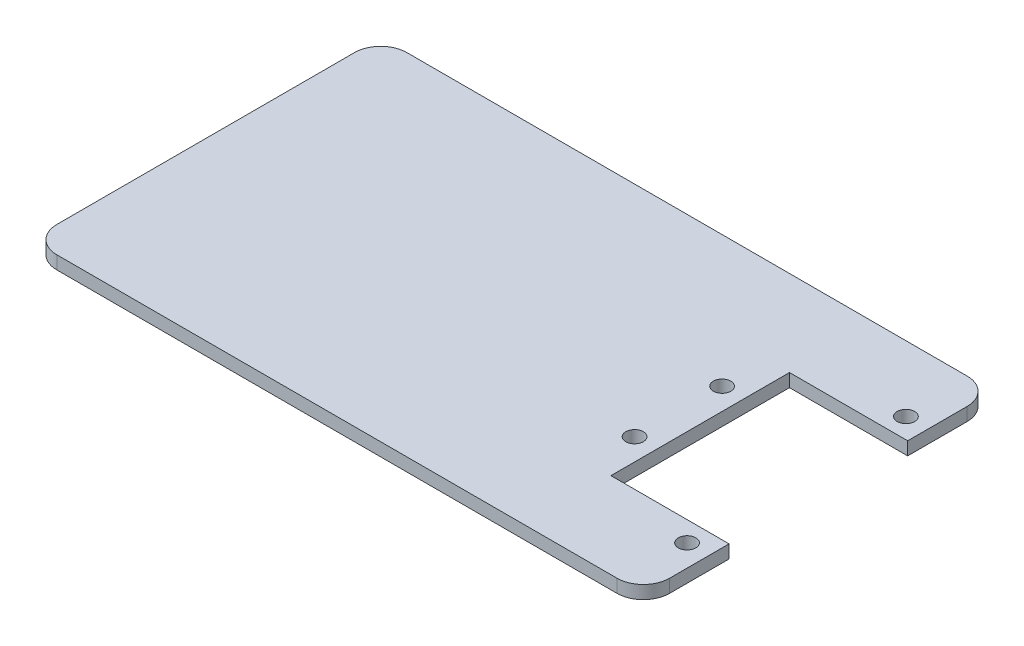
ISO-10303-21;
HEADER;
FILE_DESCRIPTION(('STEP AP214'),'2;1');
FILE_NAME('part.step','',(''),(''),'','','');
FILE_SCHEMA(('AUTOMOTIVE_DESIGN { 1 0 10303 214 1 1 1 1 }'));
ENDSEC;
DATA;
#1=APPLICATION_CONTEXT('core data for automotive mechanical design processes');
#2=APPLICATION_PROTOCOL_DEFINITION('international standard','automotive_design',2000,#1);
#3=PRODUCT_CONTEXT('',#1,'mechanical');
#4=PRODUCT('Part','Part','',(#3));
#5=PRODUCT_RELATED_PRODUCT_CATEGORY('part','',(#4));
#6=PRODUCT_DEFINITION_FORMATION('','',#4);
#7=PRODUCT_DEFINITION_CONTEXT('part definition',#1,'design');
#8=PRODUCT_DEFINITION('design','',#6,#7);
#9=PRODUCT_DEFINITION_SHAPE('','',#8);
#10=(LENGTH_UNIT() NAMED_UNIT(*) SI_UNIT(.MILLI.,.METRE.));
#11=(NAMED_UNIT(*) PLANE_ANGLE_UNIT() SI_UNIT($,.RADIAN.));
#12=(NAMED_UNIT(*) SI_UNIT($,.STERADIAN.) SOLID_ANGLE_UNIT());
#13=UNCERTAINTY_MEASURE_WITH_UNIT(LENGTH_MEASURE(1.E-05),#10,'distance_accuracy_value','');
#14=(GEOMETRIC_REPRESENTATION_CONTEXT(3) GLOBAL_UNCERTAINTY_ASSIGNED_CONTEXT((#13)) GLOBAL_UNIT_ASSIGNED_CONTEXT((#10,
#11,#12)) REPRESENTATION_CONTEXT('',''));
#15=CARTESIAN_POINT('',(0.,0.,0.));
#16=DIRECTION('',(0.,0.,1.));
#17=DIRECTION('',(1.,0.,0.));
#18=AXIS2_PLACEMENT_3D('',#15,#16,#17);
#19=CARTESIAN_POINT('',(35.,1.5,20.));
#20=DIRECTION('',(-1.,0.,0.));
#21=DIRECTION('',(0.,0.,1.));
#22=AXIS2_PLACEMENT_3D('',#19,#20,#21);
#23=PLANE('',#22);
#24=DIRECTION('',(0.,0.,-1.));
#25=VECTOR('',#24,1.);
#26=CARTESIAN_POINT('',(35.,0.,20.));
#27=LINE('',#26,#25);
#28=CARTESIAN_POINT('',(35.,0.,17.));
#29=VERTEX_POINT('',#28);
#30=CARTESIAN_POINT('',(35.,0.,10.2));
#31=VERTEX_POINT('',#30);
#32=EDGE_CURVE('E154',#29,#31,#27,.T.);
#33=ORIENTED_EDGE('',*,*,#32,.T.);
#34=DIRECTION('',(0.,1.,0.));
#35=VECTOR('',#34,1.);
#36=CARTESIAN_POINT('',(35.,0.,10.2));
#37=LINE('',#36,#35);
#38=CARTESIAN_POINT('',(35.,1.5,10.2));
#39=VERTEX_POINT('',#38);
#40=EDGE_CURVE('E221',#31,#39,#37,.T.);
#41=ORIENTED_EDGE('',*,*,#40,.T.);
#42=DIRECTION('',(0.,0.,-1.));
#43=VECTOR('',#42,1.);
#44=CARTESIAN_POINT('',(35.,1.5,20.));
#45=LINE('',#44,#43);
#46=CARTESIAN_POINT('',(35.,1.5,17.));
#47=VERTEX_POINT('',#46);
#48=EDGE_CURVE('E220',#47,#39,#45,.T.);
#49=ORIENTED_EDGE('',*,*,#48,.F.);
#50=DIRECTION('',(0.,-1.,0.));
#51=VECTOR('',#50,1.);
#52=CARTESIAN_POINT('',(35.,1.5,17.));
#53=LINE('',#52,#51);
#54=EDGE_CURVE('E193',#47,#29,#53,.T.);
#55=ORIENTED_EDGE('',*,*,#54,.T.);
#56=EDGE_LOOP('',(#33,#41,#49,#55));
#57=FACE_BOUND('',#56,.T.);
#58=ADVANCED_FACE('F46',(#57),#23,.F.);
#59=CARTESIAN_POINT('',(-35.,1.5,20.));
#60=DIRECTION('',(1.,0.,0.));
#61=DIRECTION('',(0.,0.,-1.));
#62=AXIS2_PLACEMENT_3D('',#59,#60,#61);
#63=PLANE('',#62);
#64=DIRECTION('',(0.,0.,1.));
#65=VECTOR('',#64,1.);
#66=CARTESIAN_POINT('',(-35.,1.5,20.));
#67=LINE('',#66,#65);
#68=CARTESIAN_POINT('',(-35.,1.5,-17.));
#69=VERTEX_POINT('',#68);
#70=CARTESIAN_POINT('',(-35.,1.5,17.));
#71=VERTEX_POINT('',#70);
#72=EDGE_CURVE('E166',#69,#71,#67,.T.);
#73=ORIENTED_EDGE('',*,*,#72,.F.);
#74=DIRECTION('',(0.,-1.,0.));
#75=VECTOR('',#74,1.);
#76=CARTESIAN_POINT('',(-35.,1.5,-17.));
#77=LINE('',#76,#75);
#78=CARTESIAN_POINT('',(-35.,0.,-17.));
#79=VERTEX_POINT('',#78);
#80=EDGE_CURVE('E169',#69,#79,#77,.T.);
#81=ORIENTED_EDGE('',*,*,#80,.T.);
#82=DIRECTION('',(0.,0.,1.));
#83=VECTOR('',#82,1.);
#84=CARTESIAN_POINT('',(-35.,0.,20.));
#85=LINE('',#84,#83);
#86=CARTESIAN_POINT('',(-35.,0.,17.));
#87=VERTEX_POINT('',#86);
#88=EDGE_CURVE('E160',#79,#87,#85,.T.);
#89=ORIENTED_EDGE('',*,*,#88,.T.);
#90=DIRECTION('',(0.,-1.,0.));
#91=VECTOR('',#90,1.);
#92=CARTESIAN_POINT('',(-35.,1.5,17.));
#93=LINE('',#92,#91);
#94=EDGE_CURVE('E167',#87,#71,#93,.F.);
#95=ORIENTED_EDGE('',*,*,#94,.T.);
#96=EDGE_LOOP('',(#73,#81,#89,#95));
#97=FACE_BOUND('',#96,.T.);
#98=ADVANCED_FACE('F239',(#97),#63,.F.);
#99=CARTESIAN_POINT('',(35.,1.5,20.));
#100=DIRECTION('',(0.,0.,-1.));
#101=DIRECTION('',(-1.,0.,0.));
#102=AXIS2_PLACEMENT_3D('',#99,#100,#101);
#103=PLANE('',#102);
#104=DIRECTION('',(1.,0.,0.));
#105=VECTOR('',#104,1.);
#106=CARTESIAN_POINT('',(35.,0.,20.));
#107=LINE('',#106,#105);
#108=CARTESIAN_POINT('',(-32.,0.,20.));
#109=VERTEX_POINT('',#108);
#110=CARTESIAN_POINT('',(32.,0.,20.));
#111=VERTEX_POINT('',#110);
#112=EDGE_CURVE('E155',#109,#111,#107,.T.);
#113=ORIENTED_EDGE('',*,*,#112,.T.);
#114=DIRECTION('',(0.,-1.,0.));
#115=VECTOR('',#114,1.);
#116=CARTESIAN_POINT('',(32.,1.5,20.));
#117=LINE('',#116,#115);
#118=CARTESIAN_POINT('',(32.,1.5,20.));
#119=VERTEX_POINT('',#118);
#120=EDGE_CURVE('E13',#111,#119,#117,.F.);
#121=ORIENTED_EDGE('',*,*,#120,.T.);
#122=DIRECTION('',(1.,0.,0.));
#123=VECTOR('',#122,1.);
#124=CARTESIAN_POINT('',(35.,1.5,20.));
#125=LINE('',#124,#123);
#126=CARTESIAN_POINT('',(-32.,1.5,20.));
#127=VERTEX_POINT('',#126);
#128=EDGE_CURVE('E205',#127,#119,#125,.T.);
#129=ORIENTED_EDGE('',*,*,#128,.F.);
#130=DIRECTION('',(0.,-1.,0.));
#131=VECTOR('',#130,1.);
#132=CARTESIAN_POINT('',(-32.,1.5,20.));
#133=LINE('',#132,#131);
#134=EDGE_CURVE('E54',#127,#109,#133,.T.);
#135=ORIENTED_EDGE('',*,*,#134,.T.);
#136=EDGE_LOOP('',(#113,#121,#129,#135));
#137=FACE_BOUND('',#136,.T.);
#138=ADVANCED_FACE('F202',(#137),#103,.F.);
#139=CARTESIAN_POINT('',(35.,1.5,-10.2));
#140=VERTEX_POINT('',#139);
#141=CARTESIAN_POINT('',(35.,1.5,-17.));
#142=VERTEX_POINT('',#141);
#143=EDGE_CURVE('E69',#140,#142,#45,.T.);
#144=ORIENTED_EDGE('',*,*,#143,.F.);
#145=DIRECTION('',(0.,1.,0.));
#146=VECTOR('',#145,1.);
#147=CARTESIAN_POINT('',(35.,0.,-10.2));
#148=LINE('',#147,#146);
#149=CARTESIAN_POINT('',(35.,0.,-10.2));
#150=VERTEX_POINT('',#149);
#151=EDGE_CURVE('E138',#150,#140,#148,.T.);
#152=ORIENTED_EDGE('',*,*,#151,.F.);
#153=CARTESIAN_POINT('',(35.,0.,-17.));
#154=VERTEX_POINT('',#153);
#155=EDGE_CURVE('E146',#150,#154,#27,.T.);
#156=ORIENTED_EDGE('',*,*,#155,.T.);
#157=DIRECTION('',(0.,-1.,0.));
#158=VECTOR('',#157,1.);
#159=CARTESIAN_POINT('',(35.,1.5,-17.));
#160=LINE('',#159,#158);
#161=EDGE_CURVE('E196',#154,#142,#160,.F.);
#162=ORIENTED_EDGE('',*,*,#161,.T.);
#163=EDGE_LOOP('',(#144,#152,#156,#162));
#164=FACE_BOUND('',#163,.T.);
#165=ADVANCED_FACE('F145',(#164),#23,.F.);
#166=CARTESIAN_POINT('',(35.,1.5,-20.));
#167=DIRECTION('',(0.,0.,1.));
#168=DIRECTION('',(1.,0.,0.));
#169=AXIS2_PLACEMENT_3D('',#166,#167,#168);
#170=PLANE('',#169);
#171=DIRECTION('',(-1.,0.,0.));
#172=VECTOR('',#171,1.);
#173=CARTESIAN_POINT('',(35.,0.,-20.));
#174=LINE('',#173,#172);
#175=CARTESIAN_POINT('',(32.,0.,-20.));
#176=VERTEX_POINT('',#175);
#177=CARTESIAN_POINT('',(-32.,0.,-20.));
#178=VERTEX_POINT('',#177);
#179=EDGE_CURVE('E158',#176,#178,#174,.T.);
#180=ORIENTED_EDGE('',*,*,#179,.T.);
#181=DIRECTION('',(0.,-1.,0.));
#182=VECTOR('',#181,1.);
#183=CARTESIAN_POINT('',(-32.,1.5,-20.));
#184=LINE('',#183,#182);
#185=CARTESIAN_POINT('',(-32.,1.5,-20.));
#186=VERTEX_POINT('',#185);
#187=EDGE_CURVE('E183',#178,#186,#184,.F.);
#188=ORIENTED_EDGE('',*,*,#187,.T.);
#189=DIRECTION('',(-1.,0.,0.));
#190=VECTOR('',#189,1.);
#191=CARTESIAN_POINT('',(35.,1.5,-20.));
#192=LINE('',#191,#190);
#193=CARTESIAN_POINT('',(32.,1.5,-20.));
#194=VERTEX_POINT('',#193);
#195=EDGE_CURVE('E170',#194,#186,#192,.T.);
#196=ORIENTED_EDGE('',*,*,#195,.F.);
#197=DIRECTION('',(0.,-1.,0.));
#198=VECTOR('',#197,1.);
#199=CARTESIAN_POINT('',(32.,1.5,-20.));
#200=LINE('',#199,#198);
#201=EDGE_CURVE('E180',#194,#176,#200,.T.);
#202=ORIENTED_EDGE('',*,*,#201,.T.);
#203=EDGE_LOOP('',(#180,#188,#196,#202));
#204=FACE_BOUND('',#203,.T.);
#205=ADVANCED_FACE('F246',(#204),#170,.F.);
#206=CARTESIAN_POINT('',(0.,1.5,0.));
#207=DIRECTION('',(0.,1.,0.));
#208=DIRECTION('',(0.,0.,1.));
#209=AXIS2_PLACEMENT_3D('',#206,#207,#208);
#210=PLANE('',#209);
#211=CARTESIAN_POINT('',(19.,1.5,5.));
#212=DIRECTION('',(0.,-1.,0.));
#213=DIRECTION('',(0.,0.,1.));
#214=AXIS2_PLACEMENT_3D('',#211,#212,#213);
#215=CIRCLE('',#214,1.);
#216=CARTESIAN_POINT('',(19.,1.5,6.));
#217=VERTEX_POINT('',#216);
#218=EDGE_CURVE('E405',#217,#217,#215,.T.);
#219=ORIENTED_EDGE('',*,*,#218,.T.);
#220=EDGE_LOOP('',(#219));
#221=FACE_BOUND('',#220,.T.);
#222=CARTESIAN_POINT('',(32.5,1.5,12.5000000000001));
#223=DIRECTION('',(0.,-1.,0.));
#224=DIRECTION('',(0.,0.,1.));
#225=AXIS2_PLACEMENT_3D('',#222,#223,#224);
#226=CIRCLE('',#225,0.999999999999998);
#227=CARTESIAN_POINT('',(32.5,1.5,13.5000000000001));
#228=VERTEX_POINT('',#227);
#229=EDGE_CURVE('E413',#228,#228,#226,.T.);
#230=ORIENTED_EDGE('',*,*,#229,.T.);
#231=EDGE_LOOP('',(#230));
#232=FACE_BOUND('',#231,.T.);
#233=CARTESIAN_POINT('',(32.5,1.5,-12.5000000000001));
#234=DIRECTION('',(0.,-1.,0.));
#235=DIRECTION('',(0.,0.,-1.));
#236=AXIS2_PLACEMENT_3D('',#233,#234,#235);
#237=CIRCLE('',#236,0.999999999999998);
#238=CARTESIAN_POINT('',(32.5,1.5,-13.5000000000001));
#239=VERTEX_POINT('',#238);
#240=EDGE_CURVE('E419',#239,#239,#237,.T.);
#241=ORIENTED_EDGE('',*,*,#240,.T.);
#242=EDGE_LOOP('',(#241));
#243=FACE_BOUND('',#242,.T.);
#244=CARTESIAN_POINT('',(19.,1.5,-5.));
#245=DIRECTION('',(0.,-1.,0.));
#246=DIRECTION('',(0.,0.,-1.));
#247=AXIS2_PLACEMENT_3D('',#244,#245,#246);
#248=CIRCLE('',#247,1.);
#249=CARTESIAN_POINT('',(19.,1.5,-6.));
#250=VERTEX_POINT('',#249);
#251=EDGE_CURVE('E425',#250,#250,#248,.T.);
#252=ORIENTED_EDGE('',*,*,#251,.T.);
#253=EDGE_LOOP('',(#252));
#254=FACE_BOUND('',#253,.T.);
#255=DIRECTION('',(1.,0.,0.));
#256=VECTOR('',#255,1.);
#257=CARTESIAN_POINT('',(35.,1.5,10.2));
#258=LINE('',#257,#256);
#259=CARTESIAN_POINT('',(21.5,1.5,10.2));
#260=VERTEX_POINT('',#259);
#261=EDGE_CURVE('E142',#260,#39,#258,.T.);
#262=ORIENTED_EDGE('',*,*,#261,.F.);
#263=DIRECTION('',(0.,0.,1.));
#264=VECTOR('',#263,1.);
#265=CARTESIAN_POINT('',(21.5,1.5,-10.2));
#266=LINE('',#265,#264);
#267=CARTESIAN_POINT('',(21.5,1.5,-10.2));
#268=VERTEX_POINT('',#267);
#269=EDGE_CURVE('E433',#268,#260,#266,.T.);
#270=ORIENTED_EDGE('',*,*,#269,.F.);
#271=DIRECTION('',(-1.,0.,0.));
#272=VECTOR('',#271,1.);
#273=CARTESIAN_POINT('',(35.,1.5,-10.2));
#274=LINE('',#273,#272);
#275=EDGE_CURVE('E428',#140,#268,#274,.T.);
#276=ORIENTED_EDGE('',*,*,#275,.F.);
#277=ORIENTED_EDGE('',*,*,#143,.T.);
#278=CARTESIAN_POINT('',(32.,1.5,-17.));
#279=DIRECTION('',(0.,1.,0.));
#280=DIRECTION('',(0.,0.,1.));
#281=AXIS2_PLACEMENT_3D('',#278,#279,#280);
#282=CIRCLE('',#281,3.);
#283=EDGE_CURVE('E189',#142,#194,#282,.T.);
#284=ORIENTED_EDGE('',*,*,#283,.T.);
#285=ORIENTED_EDGE('',*,*,#195,.T.);
#286=CARTESIAN_POINT('',(-32.,1.5,-17.));
#287=DIRECTION('',(0.,1.,0.));
#288=DIRECTION('',(0.,0.,1.));
#289=AXIS2_PLACEMENT_3D('',#286,#287,#288);
#290=CIRCLE('',#289,3.);
#291=EDGE_CURVE('E191',#186,#69,#290,.T.);
#292=ORIENTED_EDGE('',*,*,#291,.T.);
#293=ORIENTED_EDGE('',*,*,#72,.T.);
#294=CARTESIAN_POINT('',(-32.,1.5,17.));
#295=DIRECTION('',(0.,1.,0.));
#296=DIRECTION('',(0.,0.,1.));
#297=AXIS2_PLACEMENT_3D('',#294,#295,#296);
#298=CIRCLE('',#297,3.);
#299=EDGE_CURVE('E185',#71,#127,#298,.T.);
#300=ORIENTED_EDGE('',*,*,#299,.T.);
#301=ORIENTED_EDGE('',*,*,#128,.T.);
#302=CARTESIAN_POINT('',(32.,1.5,17.));
#303=DIRECTION('',(0.,1.,0.));
#304=DIRECTION('',(0.,0.,1.));
#305=AXIS2_PLACEMENT_3D('',#302,#303,#304);
#306=CIRCLE('',#305,3.);
#307=EDGE_CURVE('E187',#119,#47,#306,.T.);
#308=ORIENTED_EDGE('',*,*,#307,.T.);
#309=ORIENTED_EDGE('',*,*,#48,.T.);
#310=EDGE_LOOP('',(#262,#270,#276,#277,#284,#285,#292,#293,#300,#301,#308,#309));
#311=FACE_BOUND('',#310,.T.);
#312=ADVANCED_FACE('F238',(#221,#232,#243,#254,#311),#210,.T.);
#313=CARTESIAN_POINT('',(0.,0.,0.));
#314=DIRECTION('',(0.,1.,0.));
#315=DIRECTION('',(0.,0.,1.));
#316=AXIS2_PLACEMENT_3D('',#313,#314,#315);
#317=PLANE('',#316);
#318=CARTESIAN_POINT('',(19.,0.,5.));
#319=DIRECTION('',(0.,-1.,0.));
#320=DIRECTION('',(0.,0.,1.));
#321=AXIS2_PLACEMENT_3D('',#318,#319,#320);
#322=CIRCLE('',#321,1.);
#323=CARTESIAN_POINT('',(19.,0.,6.));
#324=VERTEX_POINT('',#323);
#325=EDGE_CURVE('E408',#324,#324,#322,.T.);
#326=ORIENTED_EDGE('',*,*,#325,.F.);
#327=EDGE_LOOP('',(#326));
#328=FACE_BOUND('',#327,.T.);
#329=CARTESIAN_POINT('',(32.5,0.,12.5000000000001));
#330=DIRECTION('',(0.,-1.,0.));
#331=DIRECTION('',(0.,0.,1.));
#332=AXIS2_PLACEMENT_3D('',#329,#330,#331);
#333=CIRCLE('',#332,0.999999999999998);
#334=CARTESIAN_POINT('',(32.5,0.,13.5000000000001));
#335=VERTEX_POINT('',#334);
#336=EDGE_CURVE('E410',#335,#335,#333,.T.);
#337=ORIENTED_EDGE('',*,*,#336,.F.);
#338=EDGE_LOOP('',(#337));
#339=FACE_BOUND('',#338,.T.);
#340=CARTESIAN_POINT('',(32.5,0.,-12.5000000000001));
#341=DIRECTION('',(0.,-1.,0.));
#342=DIRECTION('',(0.,0.,-1.));
#343=AXIS2_PLACEMENT_3D('',#340,#341,#342);
#344=CIRCLE('',#343,0.999999999999998);
#345=CARTESIAN_POINT('',(32.5,0.,-13.5000000000001));
#346=VERTEX_POINT('',#345);
#347=EDGE_CURVE('E416',#346,#346,#344,.T.);
#348=ORIENTED_EDGE('',*,*,#347,.F.);
#349=EDGE_LOOP('',(#348));
#350=FACE_BOUND('',#349,.T.);
#351=CARTESIAN_POINT('',(19.,0.,-5.));
#352=DIRECTION('',(0.,-1.,0.));
#353=DIRECTION('',(0.,0.,-1.));
#354=AXIS2_PLACEMENT_3D('',#351,#352,#353);
#355=CIRCLE('',#354,1.);
#356=CARTESIAN_POINT('',(19.,0.,-6.));
#357=VERTEX_POINT('',#356);
#358=EDGE_CURVE('E422',#357,#357,#355,.T.);
#359=ORIENTED_EDGE('',*,*,#358,.F.);
#360=EDGE_LOOP('',(#359));
#361=FACE_BOUND('',#360,.T.);
#362=DIRECTION('',(0.,0.,1.));
#363=VECTOR('',#362,1.);
#364=CARTESIAN_POINT('',(21.5,0.,-10.2));
#365=LINE('',#364,#363);
#366=CARTESIAN_POINT('',(21.5,0.,-10.2));
#367=VERTEX_POINT('',#366);
#368=CARTESIAN_POINT('',(21.5,0.,10.2));
#369=VERTEX_POINT('',#368);
#370=EDGE_CURVE('E61',#367,#369,#365,.T.);
#371=ORIENTED_EDGE('',*,*,#370,.T.);
#372=DIRECTION('',(1.,0.,0.));
#373=VECTOR('',#372,1.);
#374=CARTESIAN_POINT('',(35.,0.,10.2));
#375=LINE('',#374,#373);
#376=EDGE_CURVE('E148',#369,#31,#375,.T.);
#377=ORIENTED_EDGE('',*,*,#376,.T.);
#378=ORIENTED_EDGE('',*,*,#32,.F.);
#379=CARTESIAN_POINT('',(32.,0.,17.));
#380=DIRECTION('',(0.,1.,0.));
#381=DIRECTION('',(0.,0.,1.));
#382=AXIS2_PLACEMENT_3D('',#379,#380,#381);
#383=CIRCLE('',#382,3.);
#384=EDGE_CURVE('E175',#29,#111,#383,.F.);
#385=ORIENTED_EDGE('',*,*,#384,.T.);
#386=ORIENTED_EDGE('',*,*,#112,.F.);
#387=CARTESIAN_POINT('',(-32.,0.,17.));
#388=DIRECTION('',(0.,1.,0.));
#389=DIRECTION('',(0.,0.,1.));
#390=AXIS2_PLACEMENT_3D('',#387,#388,#389);
#391=CIRCLE('',#390,3.);
#392=EDGE_CURVE('E173',#109,#87,#391,.F.);
#393=ORIENTED_EDGE('',*,*,#392,.T.);
#394=ORIENTED_EDGE('',*,*,#88,.F.);
#395=CARTESIAN_POINT('',(-32.,0.,-17.));
#396=DIRECTION('',(0.,1.,0.));
#397=DIRECTION('',(0.,0.,1.));
#398=AXIS2_PLACEMENT_3D('',#395,#396,#397);
#399=CIRCLE('',#398,3.);
#400=EDGE_CURVE('E178',#79,#178,#399,.F.);
#401=ORIENTED_EDGE('',*,*,#400,.T.);
#402=ORIENTED_EDGE('',*,*,#179,.F.);
#403=CARTESIAN_POINT('',(32.,0.,-17.));
#404=DIRECTION('',(0.,1.,0.));
#405=DIRECTION('',(0.,0.,1.));
#406=AXIS2_PLACEMENT_3D('',#403,#404,#405);
#407=CIRCLE('',#406,3.);
#408=EDGE_CURVE('E152',#176,#154,#407,.F.);
#409=ORIENTED_EDGE('',*,*,#408,.T.);
#410=ORIENTED_EDGE('',*,*,#155,.F.);
#411=DIRECTION('',(-1.,0.,0.));
#412=VECTOR('',#411,1.);
#413=CARTESIAN_POINT('',(35.,0.,-10.2));
#414=LINE('',#413,#412);
#415=EDGE_CURVE('E134',#150,#367,#414,.T.);
#416=ORIENTED_EDGE('',*,*,#415,.T.);
#417=EDGE_LOOP('',(#371,#377,#378,#385,#386,#393,#394,#401,#402,#409,#410,#416));
#418=FACE_BOUND('',#417,.T.);
#419=ADVANCED_FACE('F150',(#328,#339,#350,#361,#418),#317,.F.);
#420=CARTESIAN_POINT('',(-32.,1.5,-17.));
#421=DIRECTION('',(0.,-1.,0.));
#422=DIRECTION('',(0.,0.,-1.));
#423=AXIS2_PLACEMENT_3D('',#420,#421,#422);
#424=CYLINDRICAL_SURFACE('',#423,3.);
#425=ORIENTED_EDGE('',*,*,#291,.F.);
#426=ORIENTED_EDGE('',*,*,#187,.F.);
#427=ORIENTED_EDGE('',*,*,#400,.F.);
#428=ORIENTED_EDGE('',*,*,#80,.F.);
#429=EDGE_LOOP('',(#425,#426,#427,#428));
#430=FACE_BOUND('',#429,.T.);
#431=ADVANCED_FACE('F243',(#430),#424,.T.);
#432=CARTESIAN_POINT('',(32.,1.5,-17.));
#433=DIRECTION('',(0.,-1.,0.));
#434=DIRECTION('',(0.,0.,-1.));
#435=AXIS2_PLACEMENT_3D('',#432,#433,#434);
#436=CYLINDRICAL_SURFACE('',#435,3.);
#437=ORIENTED_EDGE('',*,*,#283,.F.);
#438=ORIENTED_EDGE('',*,*,#161,.F.);
#439=ORIENTED_EDGE('',*,*,#408,.F.);
#440=ORIENTED_EDGE('',*,*,#201,.F.);
#441=EDGE_LOOP('',(#437,#438,#439,#440));
#442=FACE_BOUND('',#441,.T.);
#443=ADVANCED_FACE('F251',(#442),#436,.T.);
#444=CARTESIAN_POINT('',(32.,1.5,17.));
#445=DIRECTION('',(0.,-1.,0.));
#446=DIRECTION('',(0.,0.,-1.));
#447=AXIS2_PLACEMENT_3D('',#444,#445,#446);
#448=CYLINDRICAL_SURFACE('',#447,3.);
#449=ORIENTED_EDGE('',*,*,#307,.F.);
#450=ORIENTED_EDGE('',*,*,#120,.F.);
#451=ORIENTED_EDGE('',*,*,#384,.F.);
#452=ORIENTED_EDGE('',*,*,#54,.F.);
#453=EDGE_LOOP('',(#449,#450,#451,#452));
#454=FACE_BOUND('',#453,.T.);
#455=ADVANCED_FACE('F215',(#454),#448,.T.);
#456=CARTESIAN_POINT('',(-32.,1.5,17.));
#457=DIRECTION('',(0.,-1.,0.));
#458=DIRECTION('',(0.,0.,-1.));
#459=AXIS2_PLACEMENT_3D('',#456,#457,#458);
#460=CYLINDRICAL_SURFACE('',#459,3.);
#461=ORIENTED_EDGE('',*,*,#299,.F.);
#462=ORIENTED_EDGE('',*,*,#94,.F.);
#463=ORIENTED_EDGE('',*,*,#392,.F.);
#464=ORIENTED_EDGE('',*,*,#134,.F.);
#465=EDGE_LOOP('',(#461,#462,#463,#464));
#466=FACE_BOUND('',#465,.T.);
#467=ADVANCED_FACE('F48',(#466),#460,.T.);
#468=CARTESIAN_POINT('',(35.,0.,10.2));
#469=DIRECTION('',(0.,0.,1.));
#470=DIRECTION('',(1.,0.,0.));
#471=AXIS2_PLACEMENT_3D('',#468,#469,#470);
#472=PLANE('',#471);
#473=ORIENTED_EDGE('',*,*,#261,.T.);
#474=ORIENTED_EDGE('',*,*,#40,.F.);
#475=ORIENTED_EDGE('',*,*,#376,.F.);
#476=DIRECTION('',(0.,1.,0.));
#477=VECTOR('',#476,1.);
#478=CARTESIAN_POINT('',(21.5,0.,10.2));
#479=LINE('',#478,#477);
#480=EDGE_CURVE('E230',#369,#260,#479,.T.);
#481=ORIENTED_EDGE('',*,*,#480,.T.);
#482=EDGE_LOOP('',(#473,#474,#475,#481));
#483=FACE_BOUND('',#482,.T.);
#484=ADVANCED_FACE('F332',(#483),#472,.F.);
#485=CARTESIAN_POINT('',(21.5,0.,-10.2));
#486=DIRECTION('',(-1.,0.,0.));
#487=DIRECTION('',(0.,0.,1.));
#488=AXIS2_PLACEMENT_3D('',#485,#486,#487);
#489=PLANE('',#488);
#490=ORIENTED_EDGE('',*,*,#269,.T.);
#491=ORIENTED_EDGE('',*,*,#480,.F.);
#492=ORIENTED_EDGE('',*,*,#370,.F.);
#493=DIRECTION('',(0.,1.,0.));
#494=VECTOR('',#493,1.);
#495=CARTESIAN_POINT('',(21.5,0.,-10.2));
#496=LINE('',#495,#494);
#497=EDGE_CURVE('E139',#367,#268,#496,.T.);
#498=ORIENTED_EDGE('',*,*,#497,.T.);
#499=EDGE_LOOP('',(#490,#491,#492,#498));
#500=FACE_BOUND('',#499,.T.);
#501=ADVANCED_FACE('F342',(#500),#489,.F.);
#502=CARTESIAN_POINT('',(35.,0.,-10.2));
#503=DIRECTION('',(0.,0.,-1.));
#504=DIRECTION('',(-1.,0.,0.));
#505=AXIS2_PLACEMENT_3D('',#502,#503,#504);
#506=PLANE('',#505);
#507=ORIENTED_EDGE('',*,*,#275,.T.);
#508=ORIENTED_EDGE('',*,*,#497,.F.);
#509=ORIENTED_EDGE('',*,*,#415,.F.);
#510=ORIENTED_EDGE('',*,*,#151,.T.);
#511=EDGE_LOOP('',(#507,#508,#509,#510));
#512=FACE_BOUND('',#511,.T.);
#513=ADVANCED_FACE('F137',(#512),#506,.F.);
#514=CARTESIAN_POINT('',(19.,1.5,-5.));
#515=DIRECTION('',(0.,-1.,0.));
#516=DIRECTION('',(0.,0.,-1.));
#517=AXIS2_PLACEMENT_3D('',#514,#515,#516);
#518=CYLINDRICAL_SURFACE('',#517,1.);
#519=ORIENTED_EDGE('',*,*,#251,.F.);
#520=EDGE_LOOP('',(#519));
#521=FACE_BOUND('',#520,.T.);
#522=ORIENTED_EDGE('',*,*,#358,.T.);
#523=EDGE_LOOP('',(#522));
#524=FACE_BOUND('',#523,.T.);
#525=ADVANCED_FACE('F357',(#521,#524),#518,.F.);
#526=CARTESIAN_POINT('',(32.5,1.5,-12.5000000000001));
#527=DIRECTION('',(0.,-1.,0.));
#528=DIRECTION('',(0.,0.,-1.));
#529=AXIS2_PLACEMENT_3D('',#526,#527,#528);
#530=CYLINDRICAL_SURFACE('',#529,0.999999999999998);
#531=ORIENTED_EDGE('',*,*,#240,.F.);
#532=EDGE_LOOP('',(#531));
#533=FACE_BOUND('',#532,.T.);
#534=ORIENTED_EDGE('',*,*,#347,.T.);
#535=EDGE_LOOP('',(#534));
#536=FACE_BOUND('',#535,.T.);
#537=ADVANCED_FACE('F364',(#533,#536),#530,.F.);
#538=CARTESIAN_POINT('',(32.5,1.5,12.5000000000001));
#539=DIRECTION('',(0.,-1.,0.));
#540=DIRECTION('',(0.,0.,-1.));
#541=AXIS2_PLACEMENT_3D('',#538,#539,#540);
#542=CYLINDRICAL_SURFACE('',#541,0.999999999999998);
#543=ORIENTED_EDGE('',*,*,#229,.F.);
#544=EDGE_LOOP('',(#543));
#545=FACE_BOUND('',#544,.T.);
#546=ORIENTED_EDGE('',*,*,#336,.T.);
#547=EDGE_LOOP('',(#546));
#548=FACE_BOUND('',#547,.T.);
#549=ADVANCED_FACE('F373',(#545,#548),#542,.F.);
#550=CARTESIAN_POINT('',(19.,1.5,5.));
#551=DIRECTION('',(0.,-1.,0.));
#552=DIRECTION('',(0.,0.,-1.));
#553=AXIS2_PLACEMENT_3D('',#550,#551,#552);
#554=CYLINDRICAL_SURFACE('',#553,1.);
#555=ORIENTED_EDGE('',*,*,#218,.F.);
#556=EDGE_LOOP('',(#555));
#557=FACE_BOUND('',#556,.T.);
#558=ORIENTED_EDGE('',*,*,#325,.T.);
#559=EDGE_LOOP('',(#558));
#560=FACE_BOUND('',#559,.T.);
#561=ADVANCED_FACE('F382',(#557,#560),#554,.F.);
#562=CLOSED_SHELL('',(#58,#98,#138,#165,#205,#312,#419,#431,#443,#455,#467,#484,#501,#513,#525,
#537,#549,#561));
#563=MANIFOLD_SOLID_BREP('B2',#562);
#564=ADVANCED_BREP_SHAPE_REPRESENTATION('',(#18,#563),#14);
#565=SHAPE_DEFINITION_REPRESENTATION(#9,#564);
ENDSEC;
END-ISO-10303-21;
